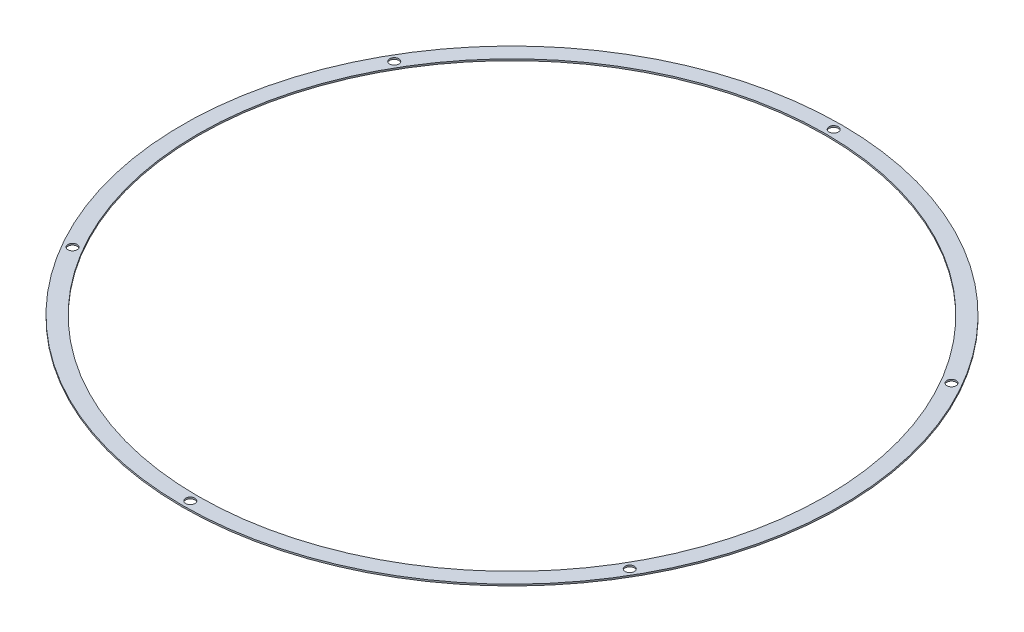
ISO-10303-21;
HEADER;
FILE_DESCRIPTION(('STEP AP214'),'2;1');
FILE_NAME('part.step','',(''),(''),'','','');
FILE_SCHEMA(('AUTOMOTIVE_DESIGN { 1 0 10303 214 1 1 1 1 }'));
ENDSEC;
DATA;
#1=APPLICATION_CONTEXT('core data for automotive mechanical design processes');
#2=APPLICATION_PROTOCOL_DEFINITION('international standard','automotive_design',2000,#1);
#3=PRODUCT_CONTEXT('',#1,'mechanical');
#4=PRODUCT('Part','Part','',(#3));
#5=PRODUCT_RELATED_PRODUCT_CATEGORY('part','',(#4));
#6=PRODUCT_DEFINITION_FORMATION('','',#4);
#7=PRODUCT_DEFINITION_CONTEXT('part definition',#1,'design');
#8=PRODUCT_DEFINITION('design','',#6,#7);
#9=PRODUCT_DEFINITION_SHAPE('','',#8);
#10=(LENGTH_UNIT() NAMED_UNIT(*) SI_UNIT(.MILLI.,.METRE.));
#11=(NAMED_UNIT(*) PLANE_ANGLE_UNIT() SI_UNIT($,.RADIAN.));
#12=(NAMED_UNIT(*) SI_UNIT($,.STERADIAN.) SOLID_ANGLE_UNIT());
#13=UNCERTAINTY_MEASURE_WITH_UNIT(LENGTH_MEASURE(1.E-05),#10,'distance_accuracy_value','');
#14=(GEOMETRIC_REPRESENTATION_CONTEXT(3) GLOBAL_UNCERTAINTY_ASSIGNED_CONTEXT((#13)) GLOBAL_UNIT_ASSIGNED_CONTEXT((#10,
#11,#12)) REPRESENTATION_CONTEXT('',''));
#15=CARTESIAN_POINT('',(0.,0.,0.));
#16=DIRECTION('',(0.,0.,1.));
#17=DIRECTION('',(1.,0.,0.));
#18=AXIS2_PLACEMENT_3D('',#15,#16,#17);
#19=CARTESIAN_POINT('',(0.,0.508,0.));
#20=DIRECTION('',(0.,-1.,0.));
#21=DIRECTION('',(0.,0.,-1.));
#22=AXIS2_PLACEMENT_3D('',#19,#20,#21);
#23=CYLINDRICAL_SURFACE('',#22,100.);
#24=CARTESIAN_POINT('',(0.,0.508,0.));
#25=DIRECTION('',(0.,1.,0.));
#26=DIRECTION('',(0.,0.,1.));
#27=AXIS2_PLACEMENT_3D('',#24,#25,#26);
#28=CIRCLE('',#27,100.);
#29=CARTESIAN_POINT('',(0.,0.508,100.));
#30=VERTEX_POINT('',#29);
#31=EDGE_CURVE('E40',#30,#30,#28,.T.);
#32=ORIENTED_EDGE('',*,*,#31,.T.);
#33=EDGE_LOOP('',(#32));
#34=FACE_BOUND('',#33,.T.);
#35=CARTESIAN_POINT('',(0.,0.,0.));
#36=DIRECTION('',(0.,1.,0.));
#37=DIRECTION('',(0.,0.,1.));
#38=AXIS2_PLACEMENT_3D('',#35,#36,#37);
#39=CIRCLE('',#38,100.);
#40=CARTESIAN_POINT('',(0.,0.,100.));
#41=VERTEX_POINT('',#40);
#42=EDGE_CURVE('E66',#41,#41,#39,.T.);
#43=ORIENTED_EDGE('',*,*,#42,.F.);
#44=EDGE_LOOP('',(#43));
#45=FACE_BOUND('',#44,.T.);
#46=ADVANCED_FACE('F32',(#34,#45),#23,.F.);
#47=CARTESIAN_POINT('',(0.,0.508,102.5));
#48=DIRECTION('',(0.,-1.,0.));
#49=DIRECTION('',(0.,0.,-1.));
#50=AXIS2_PLACEMENT_3D('',#47,#48,#49);
#51=CYLINDRICAL_SURFACE('',#50,1.4732);
#52=CARTESIAN_POINT('',(0.,0.508,102.5));
#53=DIRECTION('',(0.,1.,0.));
#54=DIRECTION('',(0.,0.,1.));
#55=AXIS2_PLACEMENT_3D('',#52,#53,#54);
#56=CIRCLE('',#55,1.4732);
#57=CARTESIAN_POINT('',(0.,0.508,103.9732));
#58=VERTEX_POINT('',#57);
#59=EDGE_CURVE('E45',#58,#58,#56,.T.);
#60=ORIENTED_EDGE('',*,*,#59,.T.);
#61=EDGE_LOOP('',(#60));
#62=FACE_BOUND('',#61,.T.);
#63=CARTESIAN_POINT('',(0.,0.,102.5));
#64=DIRECTION('',(0.,1.,0.));
#65=DIRECTION('',(0.,0.,1.));
#66=AXIS2_PLACEMENT_3D('',#63,#64,#65);
#67=CIRCLE('',#66,1.4732);
#68=CARTESIAN_POINT('',(0.,0.,103.9732));
#69=VERTEX_POINT('',#68);
#70=EDGE_CURVE('E64',#69,#69,#67,.T.);
#71=ORIENTED_EDGE('',*,*,#70,.F.);
#72=EDGE_LOOP('',(#71));
#73=FACE_BOUND('',#72,.T.);
#74=ADVANCED_FACE('F93',(#62,#73),#51,.F.);
#75=CARTESIAN_POINT('',(-88.7671038879051,0.508,51.249133974596));
#76=DIRECTION('',(0.,-1.,0.));
#77=DIRECTION('',(0.,0.,-1.));
#78=AXIS2_PLACEMENT_3D('',#75,#76,#77);
#79=CYLINDRICAL_SURFACE('',#78,1.47320000000002);
#80=CARTESIAN_POINT('',(-88.7671038879051,0.508,51.249133974596));
#81=DIRECTION('',(0.,1.,0.));
#82=DIRECTION('',(0.,0.,1.));
#83=AXIS2_PLACEMENT_3D('',#80,#81,#82);
#84=CIRCLE('',#83,1.47320000000002);
#85=CARTESIAN_POINT('',(-88.7671038879051,0.508,52.722333974596));
#86=VERTEX_POINT('',#85);
#87=EDGE_CURVE('E88',#86,#86,#84,.T.);
#88=ORIENTED_EDGE('',*,*,#87,.T.);
#89=EDGE_LOOP('',(#88));
#90=FACE_BOUND('',#89,.T.);
#91=CARTESIAN_POINT('',(-88.7671038879051,0.,51.249133974596));
#92=DIRECTION('',(0.,1.,0.));
#93=DIRECTION('',(0.,0.,1.));
#94=AXIS2_PLACEMENT_3D('',#91,#92,#93);
#95=CIRCLE('',#94,1.47320000000002);
#96=CARTESIAN_POINT('',(-88.7671038879051,0.,52.722333974596));
#97=VERTEX_POINT('',#96);
#98=EDGE_CURVE('E61',#97,#97,#95,.T.);
#99=ORIENTED_EDGE('',*,*,#98,.F.);
#100=EDGE_LOOP('',(#99));
#101=FACE_BOUND('',#100,.T.);
#102=ADVANCED_FACE('F111',(#90,#101),#79,.F.);
#103=CARTESIAN_POINT('',(-88.7661038879047,0.508,-51.2508660254042));
#104=DIRECTION('',(0.,-1.,0.));
#105=DIRECTION('',(0.,0.,-1.));
#106=AXIS2_PLACEMENT_3D('',#103,#104,#105);
#107=CYLINDRICAL_SURFACE('',#106,1.4732);
#108=CARTESIAN_POINT('',(-88.7661038879047,0.508,-51.2508660254042));
#109=DIRECTION('',(0.,1.,0.));
#110=DIRECTION('',(0.,0.,1.));
#111=AXIS2_PLACEMENT_3D('',#108,#109,#110);
#112=CIRCLE('',#111,1.4732);
#113=CARTESIAN_POINT('',(-88.7661038879047,0.508,-49.7776660254042));
#114=VERTEX_POINT('',#113);
#115=EDGE_CURVE('E85',#114,#114,#112,.T.);
#116=ORIENTED_EDGE('',*,*,#115,.T.);
#117=EDGE_LOOP('',(#116));
#118=FACE_BOUND('',#117,.T.);
#119=CARTESIAN_POINT('',(-88.7661038879047,0.,-51.2508660254042));
#120=DIRECTION('',(0.,1.,0.));
#121=DIRECTION('',(0.,0.,1.));
#122=AXIS2_PLACEMENT_3D('',#119,#120,#121);
#123=CIRCLE('',#122,1.4732);
#124=CARTESIAN_POINT('',(-88.7661038879047,0.,-49.7776660254042));
#125=VERTEX_POINT('',#124);
#126=EDGE_CURVE('E58',#125,#125,#123,.T.);
#127=ORIENTED_EDGE('',*,*,#126,.F.);
#128=EDGE_LOOP('',(#127));
#129=FACE_BOUND('',#128,.T.);
#130=ADVANCED_FACE('F118',(#118,#129),#107,.F.);
#131=CARTESIAN_POINT('',(0.00200000000073714,0.508,-102.5));
#132=DIRECTION('',(0.,-1.,0.));
#133=DIRECTION('',(0.,0.,-1.));
#134=AXIS2_PLACEMENT_3D('',#131,#132,#133);
#135=CYLINDRICAL_SURFACE('',#134,1.4732);
#136=CARTESIAN_POINT('',(0.00200000000073714,0.508,-102.5));
#137=DIRECTION('',(0.,1.,0.));
#138=DIRECTION('',(0.,0.,1.));
#139=AXIS2_PLACEMENT_3D('',#136,#137,#138);
#140=CIRCLE('',#139,1.4732);
#141=CARTESIAN_POINT('',(0.00200000000073714,0.508,-101.0268));
#142=VERTEX_POINT('',#141);
#143=EDGE_CURVE('E80',#142,#142,#140,.T.);
#144=ORIENTED_EDGE('',*,*,#143,.T.);
#145=EDGE_LOOP('',(#144));
#146=FACE_BOUND('',#145,.T.);
#147=CARTESIAN_POINT('',(0.00200000000073714,0.,-102.5));
#148=DIRECTION('',(0.,1.,0.));
#149=DIRECTION('',(0.,0.,1.));
#150=AXIS2_PLACEMENT_3D('',#147,#148,#149);
#151=CIRCLE('',#150,1.4732);
#152=CARTESIAN_POINT('',(0.00200000000073714,0.,-101.0268));
#153=VERTEX_POINT('',#152);
#154=EDGE_CURVE('E55',#153,#153,#151,.T.);
#155=ORIENTED_EDGE('',*,*,#154,.F.);
#156=EDGE_LOOP('',(#155));
#157=FACE_BOUND('',#156,.T.);
#158=ADVANCED_FACE('F122',(#146,#157),#135,.F.);
#159=CARTESIAN_POINT('',(88.7691038879054,0.508,-51.2491339745954));
#160=DIRECTION('',(0.,-1.,0.));
#161=DIRECTION('',(0.,0.,-1.));
#162=AXIS2_PLACEMENT_3D('',#159,#160,#161);
#163=CYLINDRICAL_SURFACE('',#162,1.4732);
#164=CARTESIAN_POINT('',(88.7691038879054,0.508,-51.2491339745954));
#165=DIRECTION('',(0.,1.,0.));
#166=DIRECTION('',(0.,0.,1.));
#167=AXIS2_PLACEMENT_3D('',#164,#165,#166);
#168=CIRCLE('',#167,1.4732);
#169=CARTESIAN_POINT('',(88.7691038879054,0.508,-49.7759339745954));
#170=VERTEX_POINT('',#169);
#171=EDGE_CURVE('E75',#170,#170,#168,.T.);
#172=ORIENTED_EDGE('',*,*,#171,.T.);
#173=EDGE_LOOP('',(#172));
#174=FACE_BOUND('',#173,.T.);
#175=CARTESIAN_POINT('',(88.7691038879054,0.,-51.2491339745954));
#176=DIRECTION('',(0.,1.,0.));
#177=DIRECTION('',(0.,0.,1.));
#178=AXIS2_PLACEMENT_3D('',#175,#176,#177);
#179=CIRCLE('',#178,1.4732);
#180=CARTESIAN_POINT('',(88.7691038879054,0.,-49.7759339745954));
#181=VERTEX_POINT('',#180);
#182=EDGE_CURVE('E52',#181,#181,#179,.T.);
#183=ORIENTED_EDGE('',*,*,#182,.F.);
#184=EDGE_LOOP('',(#183));
#185=FACE_BOUND('',#184,.T.);
#186=ADVANCED_FACE('F125',(#174,#185),#163,.F.);
#187=CARTESIAN_POINT('',(88.7681038879043,0.508,51.2508660254048));
#188=DIRECTION('',(0.,-1.,0.));
#189=DIRECTION('',(0.,0.,-1.));
#190=AXIS2_PLACEMENT_3D('',#187,#188,#189);
#191=CYLINDRICAL_SURFACE('',#190,1.47319999999999);
#192=CARTESIAN_POINT('',(88.7681038879043,0.508,51.2508660254048));
#193=DIRECTION('',(0.,1.,0.));
#194=DIRECTION('',(0.,0.,1.));
#195=AXIS2_PLACEMENT_3D('',#192,#193,#194);
#196=CIRCLE('',#195,1.47319999999999);
#197=CARTESIAN_POINT('',(88.7681038879043,0.508,52.7240660254048));
#198=VERTEX_POINT('',#197);
#199=EDGE_CURVE('E71',#198,#198,#196,.T.);
#200=ORIENTED_EDGE('',*,*,#199,.T.);
#201=EDGE_LOOP('',(#200));
#202=FACE_BOUND('',#201,.T.);
#203=CARTESIAN_POINT('',(88.7681038879043,0.,51.2508660254048));
#204=DIRECTION('',(0.,1.,0.));
#205=DIRECTION('',(0.,0.,1.));
#206=AXIS2_PLACEMENT_3D('',#203,#204,#205);
#207=CIRCLE('',#206,1.47319999999999);
#208=CARTESIAN_POINT('',(88.7681038879043,0.,52.7240660254048));
#209=VERTEX_POINT('',#208);
#210=EDGE_CURVE('E49',#209,#209,#207,.T.);
#211=ORIENTED_EDGE('',*,*,#210,.F.);
#212=EDGE_LOOP('',(#211));
#213=FACE_BOUND('',#212,.T.);
#214=ADVANCED_FACE('F34',(#202,#213),#191,.F.);
#215=CARTESIAN_POINT('',(0.,0.508,0.));
#216=DIRECTION('',(0.,-1.,0.));
#217=DIRECTION('',(0.,0.,-1.));
#218=AXIS2_PLACEMENT_3D('',#215,#216,#217);
#219=CYLINDRICAL_SURFACE('',#218,105.);
#220=CARTESIAN_POINT('',(0.,0.508,0.));
#221=DIRECTION('',(0.,1.,0.));
#222=DIRECTION('',(0.,0.,1.));
#223=AXIS2_PLACEMENT_3D('',#220,#221,#222);
#224=CIRCLE('',#223,105.);
#225=CARTESIAN_POINT('',(0.,0.508,105.));
#226=VERTEX_POINT('',#225);
#227=EDGE_CURVE('E10',#226,#226,#224,.T.);
#228=ORIENTED_EDGE('',*,*,#227,.F.);
#229=EDGE_LOOP('',(#228));
#230=FACE_BOUND('',#229,.T.);
#231=CARTESIAN_POINT('',(0.,0.,0.));
#232=DIRECTION('',(0.,1.,0.));
#233=DIRECTION('',(0.,0.,1.));
#234=AXIS2_PLACEMENT_3D('',#231,#232,#233);
#235=CIRCLE('',#234,105.);
#236=CARTESIAN_POINT('',(0.,0.,105.));
#237=VERTEX_POINT('',#236);
#238=EDGE_CURVE('E36',#237,#237,#235,.T.);
#239=ORIENTED_EDGE('',*,*,#238,.T.);
#240=EDGE_LOOP('',(#239));
#241=FACE_BOUND('',#240,.T.);
#242=ADVANCED_FACE('F100',(#230,#241),#219,.T.);
#243=CARTESIAN_POINT('',(-231.141421356237,0.508,0.));
#244=DIRECTION('',(0.,1.,0.));
#245=DIRECTION('',(0.,0.,1.));
#246=AXIS2_PLACEMENT_3D('',#243,#244,#245);
#247=PLANE('',#246);
#248=ORIENTED_EDGE('',*,*,#199,.F.);
#249=EDGE_LOOP('',(#248));
#250=FACE_BOUND('',#249,.T.);
#251=ORIENTED_EDGE('',*,*,#171,.F.);
#252=EDGE_LOOP('',(#251));
#253=FACE_BOUND('',#252,.T.);
#254=ORIENTED_EDGE('',*,*,#143,.F.);
#255=EDGE_LOOP('',(#254));
#256=FACE_BOUND('',#255,.T.);
#257=ORIENTED_EDGE('',*,*,#115,.F.);
#258=EDGE_LOOP('',(#257));
#259=FACE_BOUND('',#258,.T.);
#260=ORIENTED_EDGE('',*,*,#87,.F.);
#261=EDGE_LOOP('',(#260));
#262=FACE_BOUND('',#261,.T.);
#263=ORIENTED_EDGE('',*,*,#59,.F.);
#264=EDGE_LOOP('',(#263));
#265=FACE_BOUND('',#264,.T.);
#266=ORIENTED_EDGE('',*,*,#31,.F.);
#267=EDGE_LOOP('',(#266));
#268=FACE_BOUND('',#267,.T.);
#269=ORIENTED_EDGE('',*,*,#227,.T.);
#270=EDGE_LOOP('',(#269));
#271=FACE_BOUND('',#270,.T.);
#272=ADVANCED_FACE('F96',(#250,#253,#256,#259,#262,#265,#268,#271),#247,.T.);
#273=CARTESIAN_POINT('',(-231.141421356237,0.,0.));
#274=DIRECTION('',(0.,1.,0.));
#275=DIRECTION('',(0.,0.,1.));
#276=AXIS2_PLACEMENT_3D('',#273,#274,#275);
#277=PLANE('',#276);
#278=ORIENTED_EDGE('',*,*,#210,.T.);
#279=EDGE_LOOP('',(#278));
#280=FACE_BOUND('',#279,.T.);
#281=ORIENTED_EDGE('',*,*,#182,.T.);
#282=EDGE_LOOP('',(#281));
#283=FACE_BOUND('',#282,.T.);
#284=ORIENTED_EDGE('',*,*,#154,.T.);
#285=EDGE_LOOP('',(#284));
#286=FACE_BOUND('',#285,.T.);
#287=ORIENTED_EDGE('',*,*,#126,.T.);
#288=EDGE_LOOP('',(#287));
#289=FACE_BOUND('',#288,.T.);
#290=ORIENTED_EDGE('',*,*,#98,.T.);
#291=EDGE_LOOP('',(#290));
#292=FACE_BOUND('',#291,.T.);
#293=ORIENTED_EDGE('',*,*,#70,.T.);
#294=EDGE_LOOP('',(#293));
#295=FACE_BOUND('',#294,.T.);
#296=ORIENTED_EDGE('',*,*,#42,.T.);
#297=EDGE_LOOP('',(#296));
#298=FACE_BOUND('',#297,.T.);
#299=ORIENTED_EDGE('',*,*,#238,.F.);
#300=EDGE_LOOP('',(#299));
#301=FACE_BOUND('',#300,.T.);
#302=ADVANCED_FACE('F99',(#280,#283,#286,#289,#292,#295,#298,#301),#277,.F.);
#303=CLOSED_SHELL('',(#46,#74,#102,#130,#158,#186,#214,#242,#272,#302));
#304=MANIFOLD_SOLID_BREP('B2',#303);
#305=ADVANCED_BREP_SHAPE_REPRESENTATION('',(#18,#304),#14);
#306=SHAPE_DEFINITION_REPRESENTATION(#9,#305);
ENDSEC;
END-ISO-10303-21;
